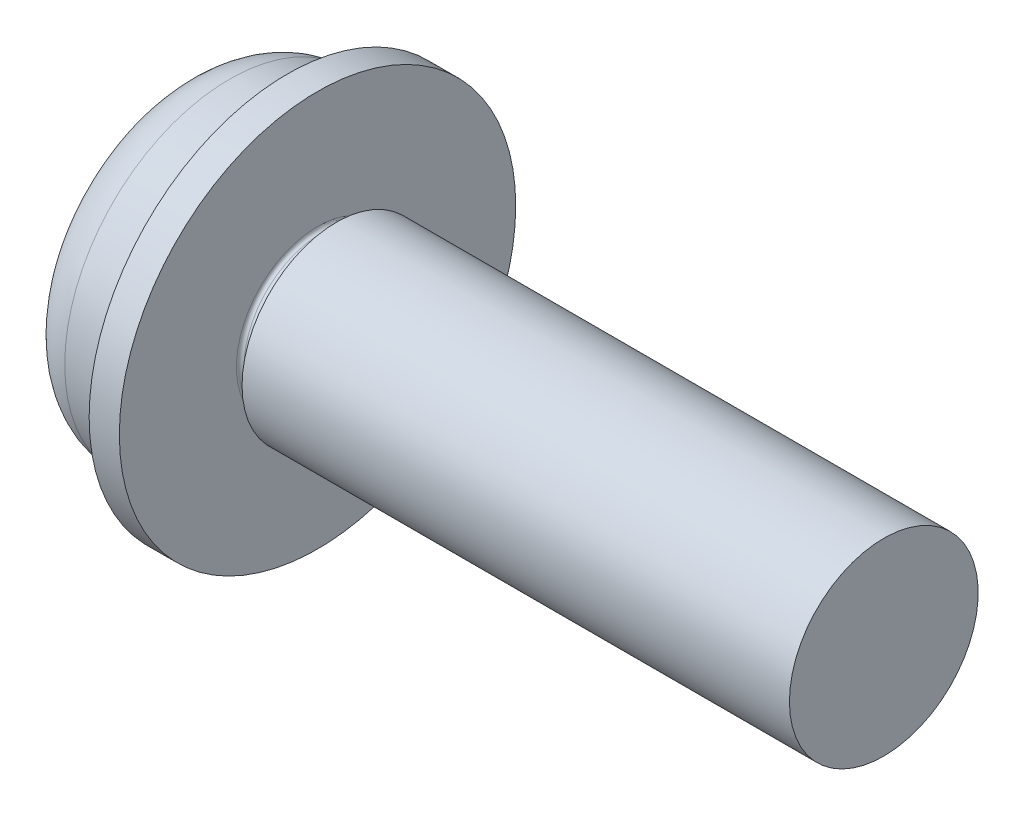
ISO-10303-21;
HEADER;
FILE_DESCRIPTION(('STEP AP214'),'2;1');
FILE_NAME('part.step','',(''),(''),'','','');
FILE_SCHEMA(('AUTOMOTIVE_DESIGN { 1 0 10303 214 1 1 1 1 }'));
ENDSEC;
DATA;
#1=APPLICATION_CONTEXT('core data for automotive mechanical design processes');
#2=APPLICATION_PROTOCOL_DEFINITION('international standard','automotive_design',2000,#1);
#3=PRODUCT_CONTEXT('',#1,'mechanical');
#4=PRODUCT('Part','Part','',(#3));
#5=PRODUCT_RELATED_PRODUCT_CATEGORY('part','',(#4));
#6=PRODUCT_DEFINITION_FORMATION('','',#4);
#7=PRODUCT_DEFINITION_CONTEXT('part definition',#1,'design');
#8=PRODUCT_DEFINITION('design','',#6,#7);
#9=PRODUCT_DEFINITION_SHAPE('','',#8);
#10=(LENGTH_UNIT() NAMED_UNIT(*) SI_UNIT(.MILLI.,.METRE.));
#11=(NAMED_UNIT(*) PLANE_ANGLE_UNIT() SI_UNIT($,.RADIAN.));
#12=(NAMED_UNIT(*) SI_UNIT($,.STERADIAN.) SOLID_ANGLE_UNIT());
#13=UNCERTAINTY_MEASURE_WITH_UNIT(LENGTH_MEASURE(1.E-05),#10,'distance_accuracy_value','');
#14=(GEOMETRIC_REPRESENTATION_CONTEXT(3) GLOBAL_UNCERTAINTY_ASSIGNED_CONTEXT((#13)) GLOBAL_UNIT_ASSIGNED_CONTEXT((#10,
#11,#12)) REPRESENTATION_CONTEXT('',''));
#15=CARTESIAN_POINT('',(0.,0.,0.));
#16=DIRECTION('',(0.,0.,1.));
#17=DIRECTION('',(1.,0.,0.));
#18=AXIS2_PLACEMENT_3D('',#15,#16,#17);
#19=CARTESIAN_POINT('',(7.9,0.,0.));
#20=DIRECTION('',(-1.,0.,0.));
#21=DIRECTION('',(0.,1.,0.));
#22=AXIS2_PLACEMENT_3D('',#19,#20,#21);
#23=SPHERICAL_SURFACE('',#22,12.);
#24=CARTESIAN_POINT('',(-3.64244197075514,0.,0.));
#25=DIRECTION('',(-1.,0.,0.));
#26=DIRECTION('',(0.,0.,1.));
#27=AXIS2_PLACEMENT_3D('',#24,#25,#26);
#28=CIRCLE('',#27,3.28207759685083);
#29=CARTESIAN_POINT('',(-3.64244197075514,0.,3.28207759685083));
#30=VERTEX_POINT('',#29);
#31=EDGE_CURVE('E168',#30,#30,#28,.T.);
#32=ORIENTED_EDGE('',*,*,#31,.T.);
#33=EDGE_LOOP('',(#32));
#34=FACE_BOUND('',#33,.T.);
#35=CARTESIAN_POINT('',(7.85356092382248,0.,0.53080106960094));
#36=DIRECTION('',(0.0871557427476584,0.,-0.996194698091746));
#37=DIRECTION('',(-0.996194698091746,0.,-0.0871557427476584));
#38=AXIS2_PLACEMENT_3D('',#35,#36,#37);
#39=CIRCLE('',#38,11.9881647317975);
#40=CARTESIAN_POINT('',(-4.06135531493124,-0.815000000000001,-0.511619028150955));
#41=VERTEX_POINT('',#40);
#42=CARTESIAN_POINT('',(-3.83138441776502,-2.47649918170802,-0.491499181708023));
#43=VERTEX_POINT('',#42);
#44=EDGE_CURVE('E364',#41,#43,#39,.F.);
#45=ORIENTED_EDGE('',*,*,#44,.F.);
#46=CARTESIAN_POINT('',(-4.0613417340348,-0.511617905899937,-0.8152));
#47=CARTESIAN_POINT('',(-4.06250531702371,-0.511693605368466,-0.798084849531843));
#48=CARTESIAN_POINT('',(-4.06356818725548,-0.513237590591993,-0.780973790710953));
#49=CARTESIAN_POINT('',(-4.06546643958668,-0.519158875325072,-0.747247205252243));
#50=CARTESIAN_POINT('',(-4.06630196956092,-0.523534326802424,-0.730631362792252));
#51=CARTESIAN_POINT('',(-4.06772147713744,-0.53501900679052,-0.698349565585518));
#52=CARTESIAN_POINT('',(-4.06830530740007,-0.542129831935163,-0.682684171808639));
#53=CARTESIAN_POINT('',(-4.06920399604611,-0.558879924284488,-0.652765517230258));
#54=CARTESIAN_POINT('',(-4.06951891696776,-0.568518602923122,-0.638511928777706));
#55=CARTESIAN_POINT('',(-4.06987025877183,-0.590022509813664,-0.611859369899082));
#56=CARTESIAN_POINT('',(-4.0699074577022,-0.601881422252092,-0.599455313693498));
#57=CARTESIAN_POINT('',(-4.06970430068445,-0.627509088053719,-0.576804789742421));
#58=CARTESIAN_POINT('',(-4.0694638887773,-0.641278225975684,-0.56655875748998));
#59=CARTESIAN_POINT('',(-4.06871285022024,-0.670316638214841,-0.54852568986943));
#60=CARTESIAN_POINT('',(-4.06820246272655,-0.685584575096586,-0.540736487866442));
#61=CARTESIAN_POINT('',(-4.06692626351934,-0.717194796155127,-0.527824647367464));
#62=CARTESIAN_POINT('',(-4.06616060278326,-0.733536440727805,-0.522700437277893));
#63=CARTESIAN_POINT('',(-4.06471308591077,-0.760853867046232,-0.51658738387827));
#64=CARTESIAN_POINT('',(-4.06409936389572,-0.771656134957833,-0.514774812472343));
#65=CARTESIAN_POINT('',(-4.06278444669774,-0.793370695324302,-0.512319214843087));
#66=CARTESIAN_POINT('',(-4.06208338708999,-0.804282793666767,-0.51167439949112));
#67=CARTESIAN_POINT('',(-4.06134173403536,-0.815199999999891,-0.511617905899313));
#68=B_SPLINE_CURVE_WITH_KNOTS('',3,(#46,#47,#48,#49,#50,#51,#52,#53,#54,#55,#56,#57,#58,#59,#60,
#61,#62,#63,#64,#65,#66,#67),.UNSPECIFIED.,.F.,.F.,(4,2,2,2,2,2,2,2,2,2,4),(0.,
0.0513981875253531,0.102762862436649,0.154157564443915,0.205540310709607,0.256779052188788,
0.308028123850438,0.359231872678555,0.41040539139939,0.443258126482291,0.476060484899457),.UNSPECIFIED.);
#69=CARTESIAN_POINT('',(-4.06135531493124,-0.511619028150955,-0.815000000000001));
#70=VERTEX_POINT('',#69);
#71=EDGE_CURVE('E60',#70,#41,#68,.T.);
#72=ORIENTED_EDGE('',*,*,#71,.F.);
#73=CARTESIAN_POINT('',(7.85356092382248,0.53080106960094,0.));
#74=DIRECTION('',(0.0871557427476584,-0.996194698091746,0.));
#75=DIRECTION('',(0.996194698091746,0.0871557427476584,0.));
#76=AXIS2_PLACEMENT_3D('',#73,#74,#75);
#77=CIRCLE('',#76,11.9881647317975);
#78=CARTESIAN_POINT('',(-3.83138441776502,-0.491499181708023,-2.47649918170802));
#79=VERTEX_POINT('',#78);
#80=EDGE_CURVE('E365',#70,#79,#77,.T.);
#81=ORIENTED_EDGE('',*,*,#80,.T.);
#82=CARTESIAN_POINT('',(8.02590674015691,0.,-1.43912062526368));
#83=DIRECTION('',(0.0871557427476584,0.,-0.996194698091746));
#84=DIRECTION('',(-0.996194698091746,0.,-0.0871557427476584));
#85=AXIS2_PLACEMENT_3D('',#82,#83,#84);
#86=CIRCLE('',#85,11.9127276187582);
#87=CARTESIAN_POINT('',(-3.83138441776502,0.491499181708024,-2.47649918170802));
#88=VERTEX_POINT('',#87);
#89=EDGE_CURVE('E425',#88,#79,#86,.F.);
#90=ORIENTED_EDGE('',*,*,#89,.F.);
#91=CARTESIAN_POINT('',(7.85356092382248,-0.53080106960094,0.));
#92=DIRECTION('',(0.0871557427476584,0.996194698091745,0.));
#93=DIRECTION('',(-0.996194698091746,0.0871557427476584,0.));
#94=AXIS2_PLACEMENT_3D('',#91,#92,#93);
#95=CIRCLE('',#94,11.9881647317975);
#96=CARTESIAN_POINT('',(-4.06135531493124,0.511619028150955,-0.815000000000001));
#97=VERTEX_POINT('',#96);
#98=EDGE_CURVE('E332',#88,#97,#95,.T.);
#99=ORIENTED_EDGE('',*,*,#98,.T.);
#100=CARTESIAN_POINT('',(-4.0613417340348,0.8152,-0.511617905899937));
#101=CARTESIAN_POINT('',(-4.06250531702371,0.798084849531843,-0.511693605368466));
#102=CARTESIAN_POINT('',(-4.06356818725548,0.780973790710953,-0.513237590591993));
#103=CARTESIAN_POINT('',(-4.06546643958668,0.747247205252243,-0.519158875325072));
#104=CARTESIAN_POINT('',(-4.06630196956092,0.730631362792252,-0.523534326802423));
#105=CARTESIAN_POINT('',(-4.06772147713744,0.698349565585518,-0.53501900679052));
#106=CARTESIAN_POINT('',(-4.06830530740007,0.682684171808638,-0.542129831935163));
#107=CARTESIAN_POINT('',(-4.06920399604611,0.652765517230257,-0.558879924284487));
#108=CARTESIAN_POINT('',(-4.06951891696776,0.638511928777706,-0.568518602923122));
#109=CARTESIAN_POINT('',(-4.06987025877183,0.611859369899082,-0.590022509813664));
#110=CARTESIAN_POINT('',(-4.0699074577022,0.599455313693498,-0.601881422252091));
#111=CARTESIAN_POINT('',(-4.06970430068445,0.576804789742421,-0.627509088053718));
#112=CARTESIAN_POINT('',(-4.0694638887773,0.56655875748998,-0.641278225975684));
#113=CARTESIAN_POINT('',(-4.06871285022024,0.54852568986943,-0.670316638214841));
#114=CARTESIAN_POINT('',(-4.06820246272655,0.540736487866442,-0.685584575096585));
#115=CARTESIAN_POINT('',(-4.06692626351934,0.527824647367464,-0.717194796155126));
#116=CARTESIAN_POINT('',(-4.06616060278326,0.522700437277893,-0.733536440727805));
#117=CARTESIAN_POINT('',(-4.06471308591077,0.51658738387827,-0.760853867046231));
#118=CARTESIAN_POINT('',(-4.06409936389572,0.514774812472343,-0.771656134957832));
#119=CARTESIAN_POINT('',(-4.06278444669774,0.512319214843087,-0.793370695324301));
#120=CARTESIAN_POINT('',(-4.06208338708999,0.511674399491119,-0.804282793666766));
#121=CARTESIAN_POINT('',(-4.06134173403536,0.511617905899312,-0.815199999999891));
#122=B_SPLINE_CURVE_WITH_KNOTS('',3,(#100,#101,#102,#103,#104,#105,#106,#107,#108,#109,#110,
#111,#112,#113,#114,#115,#116,#117,#118,#119,#120,#121),.UNSPECIFIED.,.F.,.F.,(4,2,2,2,2,2,2,2,
2,2,4),(0.,0.051398187525353,0.102762862436649,0.154157564443915,0.205540310709607,
0.256779052188788,0.308028123850437,0.359231872678555,0.41040539139939,0.443258126482291,
0.476060484899457),.UNSPECIFIED.);
#123=CARTESIAN_POINT('',(-4.06135531493124,0.815,-0.511619028150955));
#124=VERTEX_POINT('',#123);
#125=EDGE_CURVE('E326',#124,#97,#122,.T.);
#126=ORIENTED_EDGE('',*,*,#125,.F.);
#127=CARTESIAN_POINT('',(7.85356092382248,0.,0.53080106960094));
#128=DIRECTION('',(0.0871557427476584,0.,-0.996194698091746));
#129=DIRECTION('',(-0.996194698091746,0.,-0.0871557427476584));
#130=AXIS2_PLACEMENT_3D('',#127,#128,#129);
#131=CIRCLE('',#130,11.9881647317975);
#132=CARTESIAN_POINT('',(-3.83138441776502,2.47649918170803,-0.491499181708024));
#133=VERTEX_POINT('',#132);
#134=EDGE_CURVE('E324',#133,#124,#131,.F.);
#135=ORIENTED_EDGE('',*,*,#134,.F.);
#136=CARTESIAN_POINT('',(8.02590674015691,1.43912062526368,0.));
#137=DIRECTION('',(0.0871557427476584,0.996194698091746,0.));
#138=DIRECTION('',(-0.996194698091746,0.0871557427476584,0.));
#139=AXIS2_PLACEMENT_3D('',#136,#137,#138);
#140=CIRCLE('',#139,11.9127276187582);
#141=CARTESIAN_POINT('',(-3.83138441776502,2.47649918170802,0.491499181708024));
#142=VERTEX_POINT('',#141);
#143=EDGE_CURVE('E321',#133,#142,#140,.T.);
#144=ORIENTED_EDGE('',*,*,#143,.T.);
#145=CARTESIAN_POINT('',(7.85356092382248,0.,-0.530801069600941));
#146=DIRECTION('',(0.0871557427476584,0.,0.996194698091745));
#147=DIRECTION('',(0.996194698091746,0.,-0.0871557427476584));
#148=AXIS2_PLACEMENT_3D('',#145,#146,#147);
#149=CIRCLE('',#148,11.9881647317975);
#150=CARTESIAN_POINT('',(-4.06135531493124,0.815,0.511619028150954));
#151=VERTEX_POINT('',#150);
#152=EDGE_CURVE('E318',#151,#142,#149,.F.);
#153=ORIENTED_EDGE('',*,*,#152,.F.);
#154=CARTESIAN_POINT('',(-4.0613417340348,0.8152,0.511617905899936));
#155=CARTESIAN_POINT('',(-4.06250531702371,0.798084849531843,0.511693605368466));
#156=CARTESIAN_POINT('',(-4.06356818725548,0.780973790710952,0.513237590591992));
#157=CARTESIAN_POINT('',(-4.06546643958668,0.747247205252243,0.519158875325071));
#158=CARTESIAN_POINT('',(-4.06630196956092,0.730631362792251,0.523534326802423));
#159=CARTESIAN_POINT('',(-4.06772147713744,0.698349565585518,0.535019006790519));
#160=CARTESIAN_POINT('',(-4.06830530740007,0.682684171808638,0.542129831935162));
#161=CARTESIAN_POINT('',(-4.06920399604611,0.652765517230257,0.558879924284487));
#162=CARTESIAN_POINT('',(-4.06951891696776,0.638511928777705,0.568518602923121));
#163=CARTESIAN_POINT('',(-4.06987025877183,0.611859369899082,0.590022509813663));
#164=CARTESIAN_POINT('',(-4.0699074577022,0.599455313693497,0.601881422252091));
#165=CARTESIAN_POINT('',(-4.06970430068445,0.576804789742421,0.627509088053718));
#166=CARTESIAN_POINT('',(-4.0694638887773,0.56655875748998,0.641278225975683));
#167=CARTESIAN_POINT('',(-4.06871285022024,0.54852568986943,0.67031663821484));
#168=CARTESIAN_POINT('',(-4.06820246272655,0.540736487866442,0.685584575096585));
#169=CARTESIAN_POINT('',(-4.06692626351934,0.527824647367464,0.717194796155126));
#170=CARTESIAN_POINT('',(-4.06616060278326,0.522700437277893,0.733536440727804));
#171=CARTESIAN_POINT('',(-4.06471308591077,0.51658738387827,0.760853867046231));
#172=CARTESIAN_POINT('',(-4.06409936389572,0.514774812472342,0.771656134957832));
#173=CARTESIAN_POINT('',(-4.06278444669774,0.512319214843086,0.793370695324301));
#174=CARTESIAN_POINT('',(-4.06208338708999,0.511674399491119,0.804282793666766));
#175=CARTESIAN_POINT('',(-4.06134173403536,0.511617905899312,0.81519999999989));
#176=B_SPLINE_CURVE_WITH_KNOTS('',3,(#154,#155,#156,#157,#158,#159,#160,#161,#162,#163,#164,
#165,#166,#167,#168,#169,#170,#171,#172,#173,#174,#175),.UNSPECIFIED.,.F.,.F.,(4,2,2,2,2,2,2,2,
2,2,4),(0.,0.051398187525353,0.102762862436649,0.154157564443915,0.205540310709607,
0.256779052188788,0.308028123850437,0.359231872678555,0.41040539139939,0.443258126482291,
0.476060484899457),.UNSPECIFIED.);
#177=CARTESIAN_POINT('',(-4.06135531493124,0.511619028150955,0.815));
#178=VERTEX_POINT('',#177);
#179=EDGE_CURVE('E311',#151,#178,#176,.T.);
#180=ORIENTED_EDGE('',*,*,#179,.T.);
#181=CARTESIAN_POINT('',(7.85356092382248,-0.53080106960094,0.));
#182=DIRECTION('',(0.0871557427476584,0.996194698091746,0.));
#183=DIRECTION('',(-0.996194698091746,0.0871557427476584,0.));
#184=AXIS2_PLACEMENT_3D('',#181,#182,#183);
#185=CIRCLE('',#184,11.9881647317975);
#186=CARTESIAN_POINT('',(-3.83138441776502,0.491499181708023,2.47649918170802));
#187=VERTEX_POINT('',#186);
#188=EDGE_CURVE('E319',#178,#187,#185,.T.);
#189=ORIENTED_EDGE('',*,*,#188,.T.);
#190=CARTESIAN_POINT('',(8.02590674015691,0.,1.43912062526368));
#191=DIRECTION('',(0.0871557427476584,0.,0.996194698091746));
#192=DIRECTION('',(0.996194698091746,0.,-0.0871557427476584));
#193=AXIS2_PLACEMENT_3D('',#190,#191,#192);
#194=CIRCLE('',#193,11.9127276187582);
#195=CARTESIAN_POINT('',(-3.83138441776502,-0.491499181708023,2.47649918170802));
#196=VERTEX_POINT('',#195);
#197=EDGE_CURVE('E403',#196,#187,#194,.F.);
#198=ORIENTED_EDGE('',*,*,#197,.F.);
#199=CARTESIAN_POINT('',(7.85356092382248,0.530801069600939,0.));
#200=DIRECTION('',(0.0871557427476584,-0.996194698091746,0.));
#201=DIRECTION('',(0.996194698091746,0.0871557427476584,0.));
#202=AXIS2_PLACEMENT_3D('',#199,#200,#201);
#203=CIRCLE('',#202,11.9881647317975);
#204=CARTESIAN_POINT('',(-4.06135531493124,-0.511619028150955,0.815));
#205=VERTEX_POINT('',#204);
#206=EDGE_CURVE('E279',#196,#205,#203,.T.);
#207=ORIENTED_EDGE('',*,*,#206,.T.);
#208=CARTESIAN_POINT('',(-4.0613417340348,-0.815200000000001,0.511617905899936));
#209=CARTESIAN_POINT('',(-4.06250531702371,-0.798084849531844,0.511693605368465));
#210=CARTESIAN_POINT('',(-4.06356818725548,-0.780973790710953,0.513237590591992));
#211=CARTESIAN_POINT('',(-4.06546643958668,-0.747247205252243,0.519158875325071));
#212=CARTESIAN_POINT('',(-4.06630196956092,-0.730631362792252,0.523534326802423));
#213=CARTESIAN_POINT('',(-4.06772147713744,-0.698349565585519,0.535019006790519));
#214=CARTESIAN_POINT('',(-4.06830530740007,-0.682684171808639,0.542129831935162));
#215=CARTESIAN_POINT('',(-4.06920399604611,-0.652765517230258,0.558879924284487));
#216=CARTESIAN_POINT('',(-4.06951891696776,-0.638511928777706,0.568518602923121));
#217=CARTESIAN_POINT('',(-4.06987025877183,-0.611859369899083,0.590022509813663));
#218=CARTESIAN_POINT('',(-4.0699074577022,-0.599455313693498,0.601881422252091));
#219=CARTESIAN_POINT('',(-4.06970430068445,-0.576804789742421,0.627509088053718));
#220=CARTESIAN_POINT('',(-4.0694638887773,-0.56655875748998,0.641278225975683));
#221=CARTESIAN_POINT('',(-4.06871285022024,-0.548525689869431,0.67031663821484));
#222=CARTESIAN_POINT('',(-4.06820246272655,-0.540736487866442,0.685584575096584));
#223=CARTESIAN_POINT('',(-4.06692626351934,-0.527824647367465,0.717194796155125));
#224=CARTESIAN_POINT('',(-4.06616060278326,-0.522700437277893,0.733536440727804));
#225=CARTESIAN_POINT('',(-4.06471308591077,-0.516587383878271,0.760853867046231));
#226=CARTESIAN_POINT('',(-4.06409936389572,-0.514774812472343,0.771656134957832));
#227=CARTESIAN_POINT('',(-4.06278444669774,-0.512319214843087,0.793370695324301));
#228=CARTESIAN_POINT('',(-4.06208338708999,-0.51167439949112,0.804282793666766));
#229=CARTESIAN_POINT('',(-4.06134173403536,-0.511617905899313,0.81519999999989));
#230=B_SPLINE_CURVE_WITH_KNOTS('',3,(#208,#209,#210,#211,#212,#213,#214,#215,#216,#217,#218,
#219,#220,#221,#222,#223,#224,#225,#226,#227,#228,#229),.UNSPECIFIED.,.F.,.F.,(4,2,2,2,2,2,2,2,
2,2,4),(0.,0.0513981875253531,0.102762862436649,0.154157564443915,0.205540310709607,
0.256779052188788,0.308028123850438,0.359231872678555,0.41040539139939,0.443258126482291,
0.476060484899457),.UNSPECIFIED.);
#231=CARTESIAN_POINT('',(-4.06135531493124,-0.815000000000001,0.511619028150954));
#232=VERTEX_POINT('',#231);
#233=EDGE_CURVE('E273',#232,#205,#230,.T.);
#234=ORIENTED_EDGE('',*,*,#233,.F.);
#235=CARTESIAN_POINT('',(7.85356092382248,0.,-0.530801069600941));
#236=DIRECTION('',(0.0871557427476584,0.,0.996194698091746));
#237=DIRECTION('',(0.996194698091746,0.,-0.0871557427476584));
#238=AXIS2_PLACEMENT_3D('',#235,#236,#237);
#239=CIRCLE('',#238,11.9881647317975);
#240=CARTESIAN_POINT('',(-3.83138441776502,-2.47649918170802,0.491499181708024));
#241=VERTEX_POINT('',#240);
#242=EDGE_CURVE('E271',#241,#232,#239,.F.);
#243=ORIENTED_EDGE('',*,*,#242,.F.);
#244=CARTESIAN_POINT('',(8.02590674015691,-1.43912062526368,0.));
#245=DIRECTION('',(0.0871557427476584,-0.996194698091746,0.));
#246=DIRECTION('',(0.996194698091746,0.0871557427476584,0.));
#247=AXIS2_PLACEMENT_3D('',#244,#245,#246);
#248=CIRCLE('',#247,11.9127276187582);
#249=EDGE_CURVE('E268',#241,#43,#248,.T.);
#250=ORIENTED_EDGE('',*,*,#249,.T.);
#251=EDGE_LOOP('',(#45,#72,#81,#90,#99,#126,#135,#144,#153,#180,#189,#198,#207,#234,#243,#250));
#252=FACE_BOUND('',#251,.T.);
#253=ADVANCED_FACE('F37',(#34,#252),#23,.T.);
#254=CARTESIAN_POINT('',(15.,2.5,0.));
#255=DIRECTION('',(1.,0.,0.));
#256=DIRECTION('',(0.,0.,-1.));
#257=AXIS2_PLACEMENT_3D('',#254,#255,#256);
#258=PLANE('',#257);
#259=CARTESIAN_POINT('',(15.,0.,0.));
#260=DIRECTION('',(-1.,0.,0.));
#261=DIRECTION('',(0.,0.,1.));
#262=AXIS2_PLACEMENT_3D('',#259,#260,#261);
#263=CIRCLE('',#262,2.5);
#264=CARTESIAN_POINT('',(15.,0.,2.5));
#265=VERTEX_POINT('',#264);
#266=EDGE_CURVE('E265',#265,#265,#263,.T.);
#267=ORIENTED_EDGE('',*,*,#266,.F.);
#268=EDGE_LOOP('',(#267));
#269=FACE_BOUND('',#268,.T.);
#270=ADVANCED_FACE('F381',(#269),#258,.T.);
#271=CARTESIAN_POINT('',(0.,0.,0.));
#272=DIRECTION('',(-1.,0.,0.));
#273=DIRECTION('',(0.,0.,1.));
#274=AXIS2_PLACEMENT_3D('',#271,#272,#273);
#275=CYLINDRICAL_SURFACE('',#274,2.5);
#276=ORIENTED_EDGE('',*,*,#266,.T.);
#277=EDGE_LOOP('',(#276));
#278=FACE_BOUND('',#277,.T.);
#279=CARTESIAN_POINT('',(0.5,0.,0.));
#280=DIRECTION('',(-1.,0.,0.));
#281=DIRECTION('',(0.,0.,1.));
#282=AXIS2_PLACEMENT_3D('',#279,#280,#281);
#283=CIRCLE('',#282,2.5);
#284=CARTESIAN_POINT('',(0.5,0.,2.5));
#285=VERTEX_POINT('',#284);
#286=EDGE_CURVE('E262',#285,#285,#283,.T.);
#287=ORIENTED_EDGE('',*,*,#286,.F.);
#288=EDGE_LOOP('',(#287));
#289=FACE_BOUND('',#288,.T.);
#290=ADVANCED_FACE('F386',(#278,#289),#275,.T.);
#291=CARTESIAN_POINT('',(0.5,2.05,0.));
#292=DIRECTION('',(-1.,0.,0.));
#293=DIRECTION('',(0.,0.,1.));
#294=AXIS2_PLACEMENT_3D('',#291,#292,#293);
#295=PLANE('',#294);
#296=ORIENTED_EDGE('',*,*,#286,.T.);
#297=EDGE_LOOP('',(#296));
#298=FACE_BOUND('',#297,.T.);
#299=CARTESIAN_POINT('',(0.5,0.,0.));
#300=DIRECTION('',(-1.,0.,0.));
#301=DIRECTION('',(0.,0.,1.));
#302=AXIS2_PLACEMENT_3D('',#299,#300,#301);
#303=CIRCLE('',#302,2.05);
#304=CARTESIAN_POINT('',(0.5,0.,2.05));
#305=VERTEX_POINT('',#304);
#306=EDGE_CURVE('E259',#305,#305,#303,.T.);
#307=ORIENTED_EDGE('',*,*,#306,.F.);
#308=EDGE_LOOP('',(#307));
#309=FACE_BOUND('',#308,.T.);
#310=ADVANCED_FACE('F504',(#298,#309),#295,.T.);
#311=CARTESIAN_POINT('',(0.,0.,0.));
#312=DIRECTION('',(-1.,0.,0.));
#313=DIRECTION('',(0.,0.,1.));
#314=AXIS2_PLACEMENT_3D('',#311,#312,#313);
#315=CYLINDRICAL_SURFACE('',#314,2.05);
#316=CARTESIAN_POINT('',(0.1,0.,0.));
#317=DIRECTION('',(1.,0.,0.));
#318=DIRECTION('',(0.,0.,-1.));
#319=AXIS2_PLACEMENT_3D('',#316,#317,#318);
#320=CIRCLE('',#319,2.05);
#321=CARTESIAN_POINT('',(0.1,0.,-2.05));
#322=VERTEX_POINT('',#321);
#323=EDGE_CURVE('E12',#322,#322,#320,.T.);
#324=ORIENTED_EDGE('',*,*,#323,.T.);
#325=EDGE_LOOP('',(#324));
#326=FACE_BOUND('',#325,.T.);
#327=ORIENTED_EDGE('',*,*,#306,.T.);
#328=EDGE_LOOP('',(#327));
#329=FACE_BOUND('',#328,.T.);
#330=ADVANCED_FACE('F497',(#326,#329),#315,.T.);
#331=CARTESIAN_POINT('',(0.,5.25,0.));
#332=DIRECTION('',(1.,0.,0.));
#333=DIRECTION('',(0.,0.,-1.));
#334=AXIS2_PLACEMENT_3D('',#331,#332,#333);
#335=PLANE('',#334);
#336=CARTESIAN_POINT('',(0.,0.,0.));
#337=DIRECTION('',(1.,0.,0.));
#338=DIRECTION('',(0.,0.,-1.));
#339=AXIS2_PLACEMENT_3D('',#336,#337,#338);
#340=CIRCLE('',#339,2.15);
#341=CARTESIAN_POINT('',(0.,0.,-2.15));
#342=VERTEX_POINT('',#341);
#343=EDGE_CURVE('E45',#342,#342,#340,.F.);
#344=ORIENTED_EDGE('',*,*,#343,.T.);
#345=EDGE_LOOP('',(#344));
#346=FACE_BOUND('',#345,.T.);
#347=CARTESIAN_POINT('',(0.,0.,0.));
#348=DIRECTION('',(-1.,0.,0.));
#349=DIRECTION('',(0.,0.,1.));
#350=AXIS2_PLACEMENT_3D('',#347,#348,#349);
#351=CIRCLE('',#350,5.25);
#352=CARTESIAN_POINT('',(0.,0.,5.25));
#353=VERTEX_POINT('',#352);
#354=EDGE_CURVE('E256',#353,#353,#351,.T.);
#355=ORIENTED_EDGE('',*,*,#354,.F.);
#356=EDGE_LOOP('',(#355));
#357=FACE_BOUND('',#356,.T.);
#358=ADVANCED_FACE('F369',(#346,#357),#335,.T.);
#359=CARTESIAN_POINT('',(0.,0.,0.));
#360=DIRECTION('',(-1.,0.,0.));
#361=DIRECTION('',(0.,0.,1.));
#362=AXIS2_PLACEMENT_3D('',#359,#360,#361);
#363=CYLINDRICAL_SURFACE('',#362,5.25);
#364=CARTESIAN_POINT('',(-0.8,0.,0.));
#365=DIRECTION('',(-1.,0.,0.));
#366=DIRECTION('',(0.,0.,1.));
#367=AXIS2_PLACEMENT_3D('',#364,#365,#366);
#368=CIRCLE('',#367,5.25);
#369=CARTESIAN_POINT('',(-0.8,0.,5.25));
#370=VERTEX_POINT('',#369);
#371=EDGE_CURVE('E253',#370,#370,#368,.T.);
#372=ORIENTED_EDGE('',*,*,#371,.F.);
#373=EDGE_LOOP('',(#372));
#374=FACE_BOUND('',#373,.T.);
#375=ORIENTED_EDGE('',*,*,#354,.T.);
#376=EDGE_LOOP('',(#375));
#377=FACE_BOUND('',#376,.T.);
#378=ADVANCED_FACE('F481',(#374,#377),#363,.T.);
#379=CARTESIAN_POINT('',(-0.8,5.25,0.));
#380=DIRECTION('',(1.,0.,0.));
#381=DIRECTION('',(0.,0.,-1.));
#382=AXIS2_PLACEMENT_3D('',#379,#380,#381);
#383=PLANE('',#382);
#384=CARTESIAN_POINT('',(-0.8,0.,0.));
#385=DIRECTION('',(-1.,0.,0.));
#386=DIRECTION('',(0.,0.,1.));
#387=AXIS2_PLACEMENT_3D('',#384,#385,#386);
#388=CIRCLE('',#387,4.5);
#389=CARTESIAN_POINT('',(-0.8,0.,4.5));
#390=VERTEX_POINT('',#389);
#391=EDGE_CURVE('E250',#390,#390,#388,.T.);
#392=ORIENTED_EDGE('',*,*,#391,.F.);
#393=EDGE_LOOP('',(#392));
#394=FACE_BOUND('',#393,.T.);
#395=ORIENTED_EDGE('',*,*,#371,.T.);
#396=EDGE_LOOP('',(#395));
#397=FACE_BOUND('',#396,.T.);
#398=ADVANCED_FACE('F474',(#394,#397),#383,.F.);
#399=CARTESIAN_POINT('',(-2.33037033853224,0.,0.));
#400=DIRECTION('',(1.,0.,0.));
#401=DIRECTION('',(0.,0.,-1.));
#402=AXIS2_PLACEMENT_3D('',#399,#400,#401);
#403=CONICAL_SURFACE('',#402,4.36610994438209,0.087266462599721);
#404=ORIENTED_EDGE('',*,*,#391,.T.);
#405=EDGE_LOOP('',(#404));
#406=FACE_BOUND('',#405,.T.);
#407=CARTESIAN_POINT('',(-2.33037033853224,0.,0.));
#408=DIRECTION('',(-1.,0.,0.));
#409=DIRECTION('',(0.,0.,1.));
#410=AXIS2_PLACEMENT_3D('',#407,#408,#409);
#411=CIRCLE('',#410,4.36610994438209);
#412=CARTESIAN_POINT('',(-2.33037033853224,0.,4.36610994438209));
#413=VERTEX_POINT('',#412);
#414=EDGE_CURVE('E172',#413,#413,#411,.T.);
#415=ORIENTED_EDGE('',*,*,#414,.F.);
#416=EDGE_LOOP('',(#415));
#417=FACE_BOUND('',#416,.T.);
#418=ADVANCED_FACE('F467',(#406,#417),#403,.T.);
#419=CARTESIAN_POINT('',(-2.19963672441075,0.,0.));
#420=DIRECTION('',(-1.,0.,0.));
#421=DIRECTION('',(0.,0.,1.));
#422=AXIS2_PLACEMENT_3D('',#419,#420,#421);
#423=TOROIDAL_SURFACE('',#422,2.87181789724447,1.5);
#424=ORIENTED_EDGE('',*,*,#414,.T.);
#425=EDGE_LOOP('',(#424));
#426=FACE_BOUND('',#425,.T.);
#427=ORIENTED_EDGE('',*,*,#31,.F.);
#428=EDGE_LOOP('',(#427));
#429=FACE_BOUND('',#428,.T.);
#430=ADVANCED_FACE('F356',(#426,#429),#423,.T.);
#431=CARTESIAN_POINT('',(-4.1,-2.5,-0.515));
#432=DIRECTION('',(0.0871557427476584,0.,-0.996194698091746));
#433=DIRECTION('',(-0.996194698091746,0.,-0.0871557427476584));
#434=AXIS2_PLACEMENT_3D('',#431,#432,#433);
#435=PLANE('',#434);
#436=ORIENTED_EDGE('',*,*,#44,.T.);
#437=DIRECTION('',(0.992432509138967,0.0868265938642478,0.0868265938642478));
#438=VECTOR('',#437,1.);
#439=CARTESIAN_POINT('',(-4.1,-2.5,-0.515));
#440=LINE('',#439,#438);
#441=CARTESIAN_POINT('',(-2.1,-2.32502267294815,-0.340022672948152));
#442=VERTEX_POINT('',#441);
#443=EDGE_CURVE('E52',#442,#43,#440,.F.);
#444=ORIENTED_EDGE('',*,*,#443,.F.);
#445=DIRECTION('',(0.,-1.,0.));
#446=VECTOR('',#445,1.);
#447=CARTESIAN_POINT('',(-2.1,-0.815000000000001,-0.340022672948152));
#448=LINE('',#447,#446);
#449=CARTESIAN_POINT('',(-2.1,-0.815000000000001,-0.340022672948152));
#450=VERTEX_POINT('',#449);
#451=EDGE_CURVE('E156',#442,#450,#448,.F.);
#452=ORIENTED_EDGE('',*,*,#451,.T.);
#453=DIRECTION('',(-0.996194698091745,0.,-0.0871557427476584));
#454=VECTOR('',#453,1.);
#455=CARTESIAN_POINT('',(-4.1,-0.815000000000001,-0.515000000000001));
#456=LINE('',#455,#454);
#457=EDGE_CURVE('E164',#450,#41,#456,.T.);
#458=ORIENTED_EDGE('',*,*,#457,.T.);
#459=EDGE_LOOP('',(#436,#444,#452,#458));
#460=FACE_BOUND('',#459,.T.);
#461=ADVANCED_FACE('F163',(#460),#435,.F.);
#462=CARTESIAN_POINT('',(-4.1,-0.815000000000001,-0.815000000000001));
#463=DIRECTION('',(1.,0.,0.));
#464=DIRECTION('',(0.,0.,1.));
#465=AXIS2_PLACEMENT_3D('',#462,#463,#464);
#466=CONICAL_SURFACE('',#465,0.3,0.0872664625997167);
#467=ORIENTED_EDGE('',*,*,#71,.T.);
#468=ORIENTED_EDGE('',*,*,#457,.F.);
#469=CARTESIAN_POINT('',(-2.1,-0.815000000000001,-0.815000000000001));
#470=DIRECTION('',(-1.,0.,0.));
#471=DIRECTION('',(0.,0.,1.));
#472=AXIS2_PLACEMENT_3D('',#469,#470,#471);
#473=CIRCLE('',#472,0.474977327051848);
#474=CARTESIAN_POINT('',(-2.1,-0.340022672948152,-0.815000000000001));
#475=VERTEX_POINT('',#474);
#476=EDGE_CURVE('E152',#450,#475,#473,.T.);
#477=ORIENTED_EDGE('',*,*,#476,.T.);
#478=DIRECTION('',(-0.996194698091745,-0.0871557427476584,0.));
#479=VECTOR('',#478,1.);
#480=CARTESIAN_POINT('',(-4.1,-0.515000000000001,-0.815000000000001));
#481=LINE('',#480,#479);
#482=EDGE_CURVE('E169',#475,#70,#481,.T.);
#483=ORIENTED_EDGE('',*,*,#482,.T.);
#484=EDGE_LOOP('',(#467,#468,#477,#483));
#485=FACE_BOUND('',#484,.T.);
#486=ADVANCED_FACE('F167',(#485),#466,.T.);
#487=CARTESIAN_POINT('',(-4.1,-0.515,-2.5));
#488=DIRECTION('',(0.0871557427476584,-0.996194698091746,0.));
#489=DIRECTION('',(0.996194698091746,0.0871557427476584,0.));
#490=AXIS2_PLACEMENT_3D('',#487,#488,#489);
#491=PLANE('',#490);
#492=ORIENTED_EDGE('',*,*,#482,.F.);
#493=DIRECTION('',(0.,0.,1.));
#494=VECTOR('',#493,1.);
#495=CARTESIAN_POINT('',(-2.1,-0.340022672948153,-0.815));
#496=LINE('',#495,#494);
#497=CARTESIAN_POINT('',(-2.1,-0.340022672948152,-2.32502267294815));
#498=VERTEX_POINT('',#497);
#499=EDGE_CURVE('E159',#498,#475,#496,.T.);
#500=ORIENTED_EDGE('',*,*,#499,.F.);
#501=DIRECTION('',(0.992432509138967,0.0868265938642478,0.0868265938642478));
#502=VECTOR('',#501,1.);
#503=CARTESIAN_POINT('',(-4.1,-0.515,-2.5));
#504=LINE('',#503,#502);
#505=EDGE_CURVE('E174',#498,#79,#504,.F.);
#506=ORIENTED_EDGE('',*,*,#505,.T.);
#507=ORIENTED_EDGE('',*,*,#80,.F.);
#508=EDGE_LOOP('',(#492,#500,#506,#507));
#509=FACE_BOUND('',#508,.T.);
#510=ADVANCED_FACE('F348',(#509),#491,.F.);
#511=CARTESIAN_POINT('',(-4.1,-0.515,-2.5));
#512=DIRECTION('',(0.0871557427476584,0.,-0.996194698091746));
#513=DIRECTION('',(-0.996194698091746,0.,-0.0871557427476584));
#514=AXIS2_PLACEMENT_3D('',#511,#512,#513);
#515=PLANE('',#514);
#516=ORIENTED_EDGE('',*,*,#89,.T.);
#517=ORIENTED_EDGE('',*,*,#505,.F.);
#518=DIRECTION('',(0.,-1.,0.));
#519=VECTOR('',#518,1.);
#520=CARTESIAN_POINT('',(-2.1,-0.815,-2.32502267294815));
#521=LINE('',#520,#519);
#522=CARTESIAN_POINT('',(-2.1,0.340022672948152,-2.32502267294815));
#523=VERTEX_POINT('',#522);
#524=EDGE_CURVE('E218',#498,#523,#521,.F.);
#525=ORIENTED_EDGE('',*,*,#524,.T.);
#526=DIRECTION('',(0.992432509138967,-0.0868265938642478,0.0868265938642477));
#527=VECTOR('',#526,1.);
#528=CARTESIAN_POINT('',(-4.01124537955905,0.507234976875871,-2.49223497687587));
#529=LINE('',#528,#527);
#530=EDGE_CURVE('E212',#523,#88,#529,.F.);
#531=ORIENTED_EDGE('',*,*,#530,.T.);
#532=EDGE_LOOP('',(#516,#517,#525,#531));
#533=FACE_BOUND('',#532,.T.);
#534=ADVANCED_FACE('F344',(#533),#515,.F.);
#535=CARTESIAN_POINT('',(-4.1,0.515,-0.815));
#536=DIRECTION('',(0.0871557427476584,0.996194698091745,0.));
#537=DIRECTION('',(-0.996194698091746,0.0871557427476584,0.));
#538=AXIS2_PLACEMENT_3D('',#535,#536,#537);
#539=PLANE('',#538);
#540=ORIENTED_EDGE('',*,*,#530,.F.);
#541=DIRECTION('',(0.,0.,-1.));
#542=VECTOR('',#541,1.);
#543=CARTESIAN_POINT('',(-2.1,0.340022672948152,-0.815000000000001));
#544=LINE('',#543,#542);
#545=CARTESIAN_POINT('',(-2.1,0.340022672948152,-0.815000000000001));
#546=VERTEX_POINT('',#545);
#547=EDGE_CURVE('E220',#546,#523,#544,.T.);
#548=ORIENTED_EDGE('',*,*,#547,.F.);
#549=DIRECTION('',(-0.996194698091745,0.0871557427476584,0.));
#550=VECTOR('',#549,1.);
#551=CARTESIAN_POINT('',(-4.1,0.515,-0.815000000000001));
#552=LINE('',#551,#550);
#553=EDGE_CURVE('E209',#546,#97,#552,.T.);
#554=ORIENTED_EDGE('',*,*,#553,.T.);
#555=ORIENTED_EDGE('',*,*,#98,.F.);
#556=EDGE_LOOP('',(#540,#548,#554,#555));
#557=FACE_BOUND('',#556,.T.);
#558=ADVANCED_FACE('F340',(#557),#539,.F.);
#559=CARTESIAN_POINT('',(-4.1,0.815,-0.815));
#560=DIRECTION('',(1.,0.,0.));
#561=DIRECTION('',(0.,0.,1.));
#562=AXIS2_PLACEMENT_3D('',#559,#560,#561);
#563=CONICAL_SURFACE('',#562,0.3,0.0872664625997167);
#564=ORIENTED_EDGE('',*,*,#125,.T.);
#565=ORIENTED_EDGE('',*,*,#553,.F.);
#566=CARTESIAN_POINT('',(-2.1,0.815,-0.815));
#567=DIRECTION('',(-1.,0.,0.));
#568=DIRECTION('',(0.,0.,1.));
#569=AXIS2_PLACEMENT_3D('',#566,#567,#568);
#570=CIRCLE('',#569,0.474977327051848);
#571=CARTESIAN_POINT('',(-2.1,0.815,-0.340022672948152));
#572=VERTEX_POINT('',#571);
#573=EDGE_CURVE('E223',#546,#572,#570,.T.);
#574=ORIENTED_EDGE('',*,*,#573,.T.);
#575=DIRECTION('',(-0.996194698091745,0.,-0.0871557427476584));
#576=VECTOR('',#575,1.);
#577=CARTESIAN_POINT('',(-4.1,0.815,-0.515));
#578=LINE('',#577,#576);
#579=EDGE_CURVE('E206',#572,#124,#578,.T.);
#580=ORIENTED_EDGE('',*,*,#579,.T.);
#581=EDGE_LOOP('',(#564,#565,#574,#580));
#582=FACE_BOUND('',#581,.T.);
#583=ADVANCED_FACE('F334',(#582),#563,.T.);
#584=CARTESIAN_POINT('',(-4.1,0.815,-0.515));
#585=DIRECTION('',(0.0871557427476584,0.,-0.996194698091746));
#586=DIRECTION('',(-0.996194698091746,0.,-0.0871557427476584));
#587=AXIS2_PLACEMENT_3D('',#584,#585,#586);
#588=PLANE('',#587);
#589=ORIENTED_EDGE('',*,*,#134,.T.);
#590=ORIENTED_EDGE('',*,*,#579,.F.);
#591=DIRECTION('',(0.,-1.,0.));
#592=VECTOR('',#591,1.);
#593=CARTESIAN_POINT('',(-2.1,-0.815000000000001,-0.340022672948152));
#594=LINE('',#593,#592);
#595=CARTESIAN_POINT('',(-2.1,2.32502267294815,-0.340022672948152));
#596=VERTEX_POINT('',#595);
#597=EDGE_CURVE('E225',#572,#596,#594,.F.);
#598=ORIENTED_EDGE('',*,*,#597,.T.);
#599=DIRECTION('',(0.992432509138967,-0.0868265938642478,0.0868265938642478));
#600=VECTOR('',#599,1.);
#601=CARTESIAN_POINT('',(-3.95480433452136,2.48729702527752,-0.502297025277517));
#602=LINE('',#601,#600);
#603=EDGE_CURVE('E203',#596,#133,#602,.F.);
#604=ORIENTED_EDGE('',*,*,#603,.T.);
#605=EDGE_LOOP('',(#589,#590,#598,#604));
#606=FACE_BOUND('',#605,.T.);
#607=ADVANCED_FACE('F339',(#606),#588,.F.);
#608=CARTESIAN_POINT('',(-4.1,2.5,0.515));
#609=DIRECTION('',(0.0871557427476584,0.996194698091746,0.));
#610=DIRECTION('',(-0.996194698091746,0.0871557427476584,0.));
#611=AXIS2_PLACEMENT_3D('',#608,#609,#610);
#612=PLANE('',#611);
#613=ORIENTED_EDGE('',*,*,#603,.F.);
#614=DIRECTION('',(0.,0.,-1.));
#615=VECTOR('',#614,1.);
#616=CARTESIAN_POINT('',(-2.1,2.32502267294815,-0.815000000000001));
#617=LINE('',#616,#615);
#618=CARTESIAN_POINT('',(-2.1,2.32502267294815,0.340022672948152));
#619=VERTEX_POINT('',#618);
#620=EDGE_CURVE('E227',#619,#596,#617,.T.);
#621=ORIENTED_EDGE('',*,*,#620,.F.);
#622=DIRECTION('',(0.992432509138967,-0.0868265938642478,-0.0868265938642478));
#623=VECTOR('',#622,1.);
#624=CARTESIAN_POINT('',(-4.1,2.5,0.515));
#625=LINE('',#624,#623);
#626=EDGE_CURVE('E200',#619,#142,#625,.F.);
#627=ORIENTED_EDGE('',*,*,#626,.T.);
#628=ORIENTED_EDGE('',*,*,#143,.F.);
#629=EDGE_LOOP('',(#613,#621,#627,#628));
#630=FACE_BOUND('',#629,.T.);
#631=ADVANCED_FACE('F415',(#630),#612,.F.);
#632=CARTESIAN_POINT('',(-4.1,2.5,0.515));
#633=DIRECTION('',(0.0871557427476584,0.,0.996194698091745));
#634=DIRECTION('',(0.996194698091746,0.,-0.0871557427476584));
#635=AXIS2_PLACEMENT_3D('',#632,#633,#634);
#636=PLANE('',#635);
#637=ORIENTED_EDGE('',*,*,#152,.T.);
#638=ORIENTED_EDGE('',*,*,#626,.F.);
#639=DIRECTION('',(0.,1.,0.));
#640=VECTOR('',#639,1.);
#641=CARTESIAN_POINT('',(-2.1,-0.815000000000001,0.340022672948152));
#642=LINE('',#641,#640);
#643=CARTESIAN_POINT('',(-2.1,0.815,0.340022672948152));
#644=VERTEX_POINT('',#643);
#645=EDGE_CURVE('E230',#619,#644,#642,.F.);
#646=ORIENTED_EDGE('',*,*,#645,.T.);
#647=DIRECTION('',(-0.996194698091745,0.,0.0871557427476584));
#648=VECTOR('',#647,1.);
#649=CARTESIAN_POINT('',(-4.1,0.815,0.515));
#650=LINE('',#649,#648);
#651=EDGE_CURVE('E197',#644,#151,#650,.T.);
#652=ORIENTED_EDGE('',*,*,#651,.T.);
#653=EDGE_LOOP('',(#637,#638,#646,#652));
#654=FACE_BOUND('',#653,.T.);
#655=ADVANCED_FACE('F307',(#654),#636,.F.);
#656=CARTESIAN_POINT('',(-4.1,0.815,0.815));
#657=DIRECTION('',(1.,0.,0.));
#658=DIRECTION('',(0.,0.,-1.));
#659=AXIS2_PLACEMENT_3D('',#656,#657,#658);
#660=CONICAL_SURFACE('',#659,0.3,0.0872664625997167);
#661=ORIENTED_EDGE('',*,*,#651,.F.);
#662=CARTESIAN_POINT('',(-2.1,0.815,0.815));
#663=DIRECTION('',(-1.,0.,0.));
#664=DIRECTION('',(0.,0.,1.));
#665=AXIS2_PLACEMENT_3D('',#662,#663,#664);
#666=CIRCLE('',#665,0.474977327051848);
#667=CARTESIAN_POINT('',(-2.1,0.340022672948152,0.815));
#668=VERTEX_POINT('',#667);
#669=EDGE_CURVE('E232',#668,#644,#666,.F.);
#670=ORIENTED_EDGE('',*,*,#669,.F.);
#671=DIRECTION('',(-0.996194698091745,0.0871557427476584,0.));
#672=VECTOR('',#671,1.);
#673=CARTESIAN_POINT('',(-4.1,0.515,0.815));
#674=LINE('',#673,#672);
#675=EDGE_CURVE('E194',#668,#178,#674,.T.);
#676=ORIENTED_EDGE('',*,*,#675,.T.);
#677=ORIENTED_EDGE('',*,*,#179,.F.);
#678=EDGE_LOOP('',(#661,#670,#676,#677));
#679=FACE_BOUND('',#678,.T.);
#680=ADVANCED_FACE('F302',(#679),#660,.T.);
#681=CARTESIAN_POINT('',(-4.1,0.515,2.5));
#682=DIRECTION('',(0.0871557427476584,0.996194698091746,0.));
#683=DIRECTION('',(-0.996194698091746,0.0871557427476584,0.));
#684=AXIS2_PLACEMENT_3D('',#681,#682,#683);
#685=PLANE('',#684);
#686=ORIENTED_EDGE('',*,*,#675,.F.);
#687=DIRECTION('',(0.,0.,-1.));
#688=VECTOR('',#687,1.);
#689=CARTESIAN_POINT('',(-2.1,0.340022672948152,-0.815));
#690=LINE('',#689,#688);
#691=CARTESIAN_POINT('',(-2.1,0.340022672948152,2.32502267294815));
#692=VERTEX_POINT('',#691);
#693=EDGE_CURVE('E235',#692,#668,#690,.T.);
#694=ORIENTED_EDGE('',*,*,#693,.F.);
#695=DIRECTION('',(0.992432509138967,-0.0868265938642478,-0.0868265938642478));
#696=VECTOR('',#695,1.);
#697=CARTESIAN_POINT('',(-4.1,0.515,2.5));
#698=LINE('',#697,#696);
#699=EDGE_CURVE('E191',#692,#187,#698,.F.);
#700=ORIENTED_EDGE('',*,*,#699,.T.);
#701=ORIENTED_EDGE('',*,*,#188,.F.);
#702=EDGE_LOOP('',(#686,#694,#700,#701));
#703=FACE_BOUND('',#702,.T.);
#704=ADVANCED_FACE('F298',(#703),#685,.F.);
#705=CARTESIAN_POINT('',(-4.1,0.515,2.5));
#706=DIRECTION('',(0.0871557427476584,0.,0.996194698091746));
#707=DIRECTION('',(0.996194698091746,0.,-0.0871557427476584));
#708=AXIS2_PLACEMENT_3D('',#705,#706,#707);
#709=PLANE('',#708);
#710=ORIENTED_EDGE('',*,*,#197,.T.);
#711=ORIENTED_EDGE('',*,*,#699,.F.);
#712=DIRECTION('',(0.,1.,0.));
#713=VECTOR('',#712,1.);
#714=CARTESIAN_POINT('',(-2.1,-0.815000000000001,2.32502267294815));
#715=LINE('',#714,#713);
#716=CARTESIAN_POINT('',(-2.1,-0.340022672948152,2.32502267294815));
#717=VERTEX_POINT('',#716);
#718=EDGE_CURVE('E238',#692,#717,#715,.F.);
#719=ORIENTED_EDGE('',*,*,#718,.T.);
#720=DIRECTION('',(0.992432509138967,0.0868265938642477,-0.0868265938642478));
#721=VECTOR('',#720,1.);
#722=CARTESIAN_POINT('',(-4.01124537955905,-0.507234976875871,2.49223497687587));
#723=LINE('',#722,#721);
#724=EDGE_CURVE('E188',#717,#196,#723,.F.);
#725=ORIENTED_EDGE('',*,*,#724,.T.);
#726=EDGE_LOOP('',(#710,#711,#719,#725));
#727=FACE_BOUND('',#726,.T.);
#728=ADVANCED_FACE('F294',(#727),#709,.F.);
#729=CARTESIAN_POINT('',(-4.1,-0.515000000000001,0.815));
#730=DIRECTION('',(0.0871557427476584,-0.996194698091746,0.));
#731=DIRECTION('',(0.996194698091746,0.0871557427476584,0.));
#732=AXIS2_PLACEMENT_3D('',#729,#730,#731);
#733=PLANE('',#732);
#734=ORIENTED_EDGE('',*,*,#724,.F.);
#735=DIRECTION('',(0.,0.,1.));
#736=VECTOR('',#735,1.);
#737=CARTESIAN_POINT('',(-2.1,-0.340022672948154,-0.815000000000001));
#738=LINE('',#737,#736);
#739=CARTESIAN_POINT('',(-2.1,-0.340022672948153,0.815));
#740=VERTEX_POINT('',#739);
#741=EDGE_CURVE('E240',#740,#717,#738,.T.);
#742=ORIENTED_EDGE('',*,*,#741,.F.);
#743=DIRECTION('',(-0.996194698091745,-0.0871557427476584,0.));
#744=VECTOR('',#743,1.);
#745=CARTESIAN_POINT('',(-4.1,-0.515000000000001,0.815));
#746=LINE('',#745,#744);
#747=EDGE_CURVE('E185',#740,#205,#746,.T.);
#748=ORIENTED_EDGE('',*,*,#747,.T.);
#749=ORIENTED_EDGE('',*,*,#206,.F.);
#750=EDGE_LOOP('',(#734,#742,#748,#749));
#751=FACE_BOUND('',#750,.T.);
#752=ADVANCED_FACE('F289',(#751),#733,.F.);
#753=CARTESIAN_POINT('',(-4.1,-0.815000000000001,0.815));
#754=DIRECTION('',(1.,0.,0.));
#755=DIRECTION('',(0.,0.,1.));
#756=AXIS2_PLACEMENT_3D('',#753,#754,#755);
#757=CONICAL_SURFACE('',#756,0.3,0.0872664625997167);
#758=ORIENTED_EDGE('',*,*,#233,.T.);
#759=ORIENTED_EDGE('',*,*,#747,.F.);
#760=CARTESIAN_POINT('',(-2.1,-0.815000000000001,0.815));
#761=DIRECTION('',(-1.,0.,0.));
#762=DIRECTION('',(0.,0.,1.));
#763=AXIS2_PLACEMENT_3D('',#760,#761,#762);
#764=CIRCLE('',#763,0.474977327051848);
#765=CARTESIAN_POINT('',(-2.1,-0.815000000000001,0.340022672948151));
#766=VERTEX_POINT('',#765);
#767=EDGE_CURVE('E243',#740,#766,#764,.T.);
#768=ORIENTED_EDGE('',*,*,#767,.T.);
#769=DIRECTION('',(-0.996194698091745,0.,0.0871557427476584));
#770=VECTOR('',#769,1.);
#771=CARTESIAN_POINT('',(-4.1,-0.815000000000001,0.515));
#772=LINE('',#771,#770);
#773=EDGE_CURVE('E182',#766,#232,#772,.T.);
#774=ORIENTED_EDGE('',*,*,#773,.T.);
#775=EDGE_LOOP('',(#758,#759,#768,#774));
#776=FACE_BOUND('',#775,.T.);
#777=ADVANCED_FACE('F283',(#776),#757,.T.);
#778=CARTESIAN_POINT('',(-4.1,-0.815000000000001,0.515));
#779=DIRECTION('',(0.0871557427476584,0.,0.996194698091746));
#780=DIRECTION('',(0.996194698091746,0.,-0.0871557427476584));
#781=AXIS2_PLACEMENT_3D('',#778,#779,#780);
#782=PLANE('',#781);
#783=ORIENTED_EDGE('',*,*,#242,.T.);
#784=ORIENTED_EDGE('',*,*,#773,.F.);
#785=DIRECTION('',(0.,1.,0.));
#786=VECTOR('',#785,1.);
#787=CARTESIAN_POINT('',(-2.1,-0.815000000000001,0.340022672948152));
#788=LINE('',#787,#786);
#789=CARTESIAN_POINT('',(-2.1,-2.32502267294815,0.340022672948152));
#790=VERTEX_POINT('',#789);
#791=EDGE_CURVE('E245',#766,#790,#788,.F.);
#792=ORIENTED_EDGE('',*,*,#791,.T.);
#793=DIRECTION('',(0.992432509138967,0.0868265938642478,-0.0868265938642478));
#794=VECTOR('',#793,1.);
#795=CARTESIAN_POINT('',(-3.95480433452136,-2.48729702527752,0.502297025277517));
#796=LINE('',#795,#794);
#797=EDGE_CURVE('E178',#790,#241,#796,.F.);
#798=ORIENTED_EDGE('',*,*,#797,.T.);
#799=EDGE_LOOP('',(#783,#784,#792,#798));
#800=FACE_BOUND('',#799,.T.);
#801=ADVANCED_FACE('F288',(#800),#782,.F.);
#802=CARTESIAN_POINT('',(-4.1,-2.5,-0.515));
#803=DIRECTION('',(0.0871557427476584,-0.996194698091746,0.));
#804=DIRECTION('',(0.996194698091746,0.0871557427476584,0.));
#805=AXIS2_PLACEMENT_3D('',#802,#803,#804);
#806=PLANE('',#805);
#807=ORIENTED_EDGE('',*,*,#797,.F.);
#808=DIRECTION('',(0.,0.,1.));
#809=VECTOR('',#808,1.);
#810=CARTESIAN_POINT('',(-2.1,-2.32502267294815,-0.815000000000001));
#811=LINE('',#810,#809);
#812=EDGE_CURVE('E179',#442,#790,#811,.T.);
#813=ORIENTED_EDGE('',*,*,#812,.F.);
#814=ORIENTED_EDGE('',*,*,#443,.T.);
#815=ORIENTED_EDGE('',*,*,#249,.F.);
#816=EDGE_LOOP('',(#807,#813,#814,#815));
#817=FACE_BOUND('',#816,.T.);
#818=ADVANCED_FACE('F377',(#817),#806,.F.);
#819=CARTESIAN_POINT('',(-2.1,-0.815000000000001,-0.815000000000001));
#820=DIRECTION('',(-1.,0.,0.));
#821=DIRECTION('',(0.,0.,1.));
#822=AXIS2_PLACEMENT_3D('',#819,#820,#821);
#823=PLANE('',#822);
#824=ORIENTED_EDGE('',*,*,#451,.F.);
#825=ORIENTED_EDGE('',*,*,#812,.T.);
#826=ORIENTED_EDGE('',*,*,#791,.F.);
#827=ORIENTED_EDGE('',*,*,#767,.F.);
#828=ORIENTED_EDGE('',*,*,#741,.T.);
#829=ORIENTED_EDGE('',*,*,#718,.F.);
#830=ORIENTED_EDGE('',*,*,#693,.T.);
#831=ORIENTED_EDGE('',*,*,#669,.T.);
#832=ORIENTED_EDGE('',*,*,#645,.F.);
#833=ORIENTED_EDGE('',*,*,#620,.T.);
#834=ORIENTED_EDGE('',*,*,#597,.F.);
#835=ORIENTED_EDGE('',*,*,#573,.F.);
#836=ORIENTED_EDGE('',*,*,#547,.T.);
#837=ORIENTED_EDGE('',*,*,#524,.F.);
#838=ORIENTED_EDGE('',*,*,#499,.T.);
#839=ORIENTED_EDGE('',*,*,#476,.F.);
#840=EDGE_LOOP('',(#824,#825,#826,#827,#828,#829,#830,#831,#832,#833,#834,#835,#836,#837,#838,#839));
#841=FACE_BOUND('',#840,.T.);
#842=ADVANCED_FACE('F154',(#841),#823,.T.);
#843=CARTESIAN_POINT('',(0.1,0.,0.));
#844=DIRECTION('',(1.,0.,0.));
#845=DIRECTION('',(0.,0.,-1.));
#846=AXIS2_PLACEMENT_3D('',#843,#844,#845);
#847=TOROIDAL_SURFACE('',#846,2.15,0.1);
#848=ORIENTED_EDGE('',*,*,#323,.F.);
#849=EDGE_LOOP('',(#848));
#850=FACE_BOUND('',#849,.T.);
#851=ORIENTED_EDGE('',*,*,#343,.F.);
#852=EDGE_LOOP('',(#851));
#853=FACE_BOUND('',#852,.T.);
#854=ADVANCED_FACE('F39',(#850,#853),#847,.F.);
#855=CLOSED_SHELL('',(#253,#270,#290,#310,#330,#358,#378,#398,#418,#430,#461,#486,#510,#534,
#558,#583,#607,#631,#655,#680,#704,#728,#752,#777,#801,#818,#842,#854));
#856=MANIFOLD_SOLID_BREP('B2',#855);
#857=ADVANCED_BREP_SHAPE_REPRESENTATION('',(#18,#856),#14);
#858=SHAPE_DEFINITION_REPRESENTATION(#9,#857);
ENDSEC;
END-ISO-10303-21;
